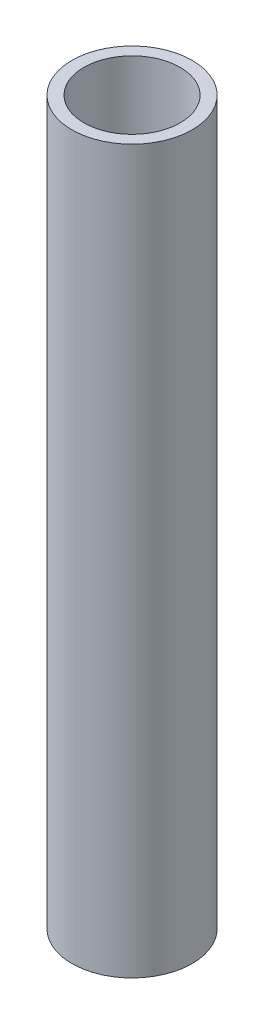
ISO-10303-21;
HEADER;
FILE_DESCRIPTION(('STEP AP214'),'2;1');
FILE_NAME('part.step','',(''),(''),'','','');
FILE_SCHEMA(('AUTOMOTIVE_DESIGN { 1 0 10303 214 1 1 1 1 }'));
ENDSEC;
DATA;
#1=APPLICATION_CONTEXT('core data for automotive mechanical design processes');
#2=APPLICATION_PROTOCOL_DEFINITION('international standard','automotive_design',2000,#1);
#3=PRODUCT_CONTEXT('',#1,'mechanical');
#4=PRODUCT('Part','Part','',(#3));
#5=PRODUCT_RELATED_PRODUCT_CATEGORY('part','',(#4));
#6=PRODUCT_DEFINITION_FORMATION('','',#4);
#7=PRODUCT_DEFINITION_CONTEXT('part definition',#1,'design');
#8=PRODUCT_DEFINITION('design','',#6,#7);
#9=PRODUCT_DEFINITION_SHAPE('','',#8);
#10=(LENGTH_UNIT() NAMED_UNIT(*) SI_UNIT(.MILLI.,.METRE.));
#11=(NAMED_UNIT(*) PLANE_ANGLE_UNIT() SI_UNIT($,.RADIAN.));
#12=(NAMED_UNIT(*) SI_UNIT($,.STERADIAN.) SOLID_ANGLE_UNIT());
#13=UNCERTAINTY_MEASURE_WITH_UNIT(LENGTH_MEASURE(1.E-05),#10,'distance_accuracy_value','');
#14=(GEOMETRIC_REPRESENTATION_CONTEXT(3) GLOBAL_UNCERTAINTY_ASSIGNED_CONTEXT((#13)) GLOBAL_UNIT_ASSIGNED_CONTEXT((#10,
#11,#12)) REPRESENTATION_CONTEXT('',''));
#15=CARTESIAN_POINT('',(0.,0.,0.));
#16=DIRECTION('',(0.,0.,1.));
#17=DIRECTION('',(1.,0.,0.));
#18=AXIS2_PLACEMENT_3D('',#15,#16,#17);
#19=CARTESIAN_POINT('',(0.,38.1,0.));
#20=DIRECTION('',(0.,1.,0.));
#21=DIRECTION('',(0.,0.,1.));
#22=AXIS2_PLACEMENT_3D('',#19,#20,#21);
#23=PLANE('',#22);
#24=CARTESIAN_POINT('',(0.,38.1,0.));
#25=DIRECTION('',(0.,1.,0.));
#26=DIRECTION('',(0.,0.,1.));
#27=AXIS2_PLACEMENT_3D('',#24,#25,#26);
#28=CIRCLE('',#27,3.175);
#29=CARTESIAN_POINT('',(0.,38.1,-3.175));
#30=VERTEX_POINT('',#29);
#31=EDGE_CURVE('E10',#30,#30,#28,.T.);
#32=ORIENTED_EDGE('',*,*,#31,.T.);
#33=EDGE_LOOP('',(#32));
#34=FACE_BOUND('',#33,.T.);
#35=CARTESIAN_POINT('',(0.,38.1,0.));
#36=DIRECTION('',(0.,1.,0.));
#37=DIRECTION('',(0.,0.,1.));
#38=AXIS2_PLACEMENT_3D('',#35,#36,#37);
#39=CIRCLE('',#38,2.54);
#40=CARTESIAN_POINT('',(0.,38.1,-2.54));
#41=VERTEX_POINT('',#40);
#42=EDGE_CURVE('E46',#41,#41,#39,.T.);
#43=ORIENTED_EDGE('',*,*,#42,.F.);
#44=EDGE_LOOP('',(#43));
#45=FACE_BOUND('',#44,.T.);
#46=ADVANCED_FACE('F35',(#34,#45),#23,.T.);
#47=CARTESIAN_POINT('',(0.,0.,0.));
#48=DIRECTION('',(0.,1.,0.));
#49=DIRECTION('',(0.,0.,1.));
#50=AXIS2_PLACEMENT_3D('',#47,#48,#49);
#51=PLANE('',#50);
#52=CARTESIAN_POINT('',(0.,0.,0.));
#53=DIRECTION('',(0.,1.,0.));
#54=DIRECTION('',(0.,0.,1.));
#55=AXIS2_PLACEMENT_3D('',#52,#53,#54);
#56=CIRCLE('',#55,3.175);
#57=CARTESIAN_POINT('',(0.,0.,-3.175));
#58=VERTEX_POINT('',#57);
#59=EDGE_CURVE('E39',#58,#58,#56,.T.);
#60=ORIENTED_EDGE('',*,*,#59,.F.);
#61=EDGE_LOOP('',(#60));
#62=FACE_BOUND('',#61,.T.);
#63=CARTESIAN_POINT('',(0.,0.,0.));
#64=DIRECTION('',(0.,1.,0.));
#65=DIRECTION('',(0.,0.,1.));
#66=AXIS2_PLACEMENT_3D('',#63,#64,#65);
#67=CIRCLE('',#66,2.54);
#68=CARTESIAN_POINT('',(0.,0.,-2.54));
#69=VERTEX_POINT('',#68);
#70=EDGE_CURVE('E48',#69,#69,#67,.T.);
#71=ORIENTED_EDGE('',*,*,#70,.T.);
#72=EDGE_LOOP('',(#71));
#73=FACE_BOUND('',#72,.T.);
#74=ADVANCED_FACE('F58',(#62,#73),#51,.F.);
#75=CARTESIAN_POINT('',(0.,38.1,0.));
#76=DIRECTION('',(0.,-1.,0.));
#77=DIRECTION('',(0.,0.,-1.));
#78=AXIS2_PLACEMENT_3D('',#75,#76,#77);
#79=CYLINDRICAL_SURFACE('',#78,3.175);
#80=CARTESIAN_POINT('',(0.,38.1,-3.175));
#81=CARTESIAN_POINT('',(0.,37.703125,-3.175));
#82=CARTESIAN_POINT('',(0.,37.30625,-3.175));
#83=CARTESIAN_POINT('',(0.,36.5125,-3.175));
#84=CARTESIAN_POINT('',(0.,36.115625,-3.175));
#85=CARTESIAN_POINT('',(0.,35.321875,-3.175));
#86=CARTESIAN_POINT('',(0.,34.925,-3.175));
#87=CARTESIAN_POINT('',(0.,34.13125,-3.175));
#88=CARTESIAN_POINT('',(0.,33.734375,-3.175));
#89=CARTESIAN_POINT('',(0.,32.940625,-3.175));
#90=CARTESIAN_POINT('',(0.,32.54375,-3.175));
#91=CARTESIAN_POINT('',(0.,31.75,-3.175));
#92=CARTESIAN_POINT('',(0.,31.353125,-3.175));
#93=CARTESIAN_POINT('',(0.,30.559375,-3.175));
#94=CARTESIAN_POINT('',(0.,30.1625,-3.175));
#95=CARTESIAN_POINT('',(0.,29.36875,-3.175));
#96=CARTESIAN_POINT('',(0.,28.971875,-3.175));
#97=CARTESIAN_POINT('',(0.,28.178125,-3.175));
#98=CARTESIAN_POINT('',(0.,27.78125,-3.175));
#99=CARTESIAN_POINT('',(0.,26.9875,-3.175));
#100=CARTESIAN_POINT('',(0.,26.590625,-3.175));
#101=CARTESIAN_POINT('',(0.,25.796875,-3.175));
#102=CARTESIAN_POINT('',(0.,25.4,-3.175));
#103=CARTESIAN_POINT('',(0.,24.60625,-3.175));
#104=CARTESIAN_POINT('',(0.,24.209375,-3.175));
#105=CARTESIAN_POINT('',(0.,23.415625,-3.175));
#106=CARTESIAN_POINT('',(0.,23.01875,-3.175));
#107=CARTESIAN_POINT('',(0.,22.225,-3.175));
#108=CARTESIAN_POINT('',(0.,21.828125,-3.175));
#109=CARTESIAN_POINT('',(0.,21.034375,-3.175));
#110=CARTESIAN_POINT('',(0.,20.6375,-3.175));
#111=CARTESIAN_POINT('',(0.,19.84375,-3.175));
#112=CARTESIAN_POINT('',(0.,19.446875,-3.175));
#113=CARTESIAN_POINT('',(0.,18.653125,-3.175));
#114=CARTESIAN_POINT('',(0.,18.25625,-3.175));
#115=CARTESIAN_POINT('',(0.,17.4625,-3.175));
#116=CARTESIAN_POINT('',(0.,17.065625,-3.175));
#117=CARTESIAN_POINT('',(0.,16.271875,-3.175));
#118=CARTESIAN_POINT('',(0.,15.875,-3.175));
#119=CARTESIAN_POINT('',(0.,15.08125,-3.175));
#120=CARTESIAN_POINT('',(0.,14.684375,-3.175));
#121=CARTESIAN_POINT('',(0.,13.890625,-3.175));
#122=CARTESIAN_POINT('',(0.,13.49375,-3.175));
#123=CARTESIAN_POINT('',(0.,12.7,-3.175));
#124=CARTESIAN_POINT('',(0.,12.303125,-3.175));
#125=CARTESIAN_POINT('',(0.,11.509375,-3.175));
#126=CARTESIAN_POINT('',(0.,11.1125,-3.175));
#127=CARTESIAN_POINT('',(0.,10.31875,-3.175));
#128=CARTESIAN_POINT('',(0.,9.921875,-3.175));
#129=CARTESIAN_POINT('',(0.,9.128125,-3.175));
#130=CARTESIAN_POINT('',(0.,8.73125,-3.175));
#131=CARTESIAN_POINT('',(0.,7.9375,-3.175));
#132=CARTESIAN_POINT('',(0.,7.540625,-3.175));
#133=CARTESIAN_POINT('',(0.,6.746875,-3.175));
#134=CARTESIAN_POINT('',(0.,6.35,-3.175));
#135=CARTESIAN_POINT('',(0.,5.55625,-3.175));
#136=CARTESIAN_POINT('',(0.,5.159375,-3.175));
#137=CARTESIAN_POINT('',(0.,4.365625,-3.175));
#138=CARTESIAN_POINT('',(0.,3.96875,-3.175));
#139=CARTESIAN_POINT('',(0.,3.175,-3.175));
#140=CARTESIAN_POINT('',(0.,2.778125,-3.175));
#141=CARTESIAN_POINT('',(0.,1.984375,-3.175));
#142=CARTESIAN_POINT('',(0.,1.5875,-3.175));
#143=CARTESIAN_POINT('',(0.,0.79375,-3.175));
#144=CARTESIAN_POINT('',(0.,0.396875,-3.175));
#145=CARTESIAN_POINT('',(0.,0.,-3.175));
#146=B_SPLINE_CURVE_WITH_KNOTS('',3,(#80,#81,#82,#83,#84,#85,#86,#87,#88,#89,#90,#91,#92,#93,
#94,#95,#96,#97,#98,#99,#100,#101,#102,#103,#104,#105,#106,#107,#108,#109,#110,#111,#112,#113,
#114,#115,#116,#117,#118,#119,#120,#121,#122,#123,#124,#125,#126,#127,#128,#129,#130,#131,#132,
#133,#134,#135,#136,#137,#138,#139,#140,#141,#142,#143,#144,#145),.UNSPECIFIED.,.F.,.F.,(4,2,2,
2,2,2,2,2,2,2,2,2,2,2,2,2,2,2,2,2,2,2,2,2,2,2,2,2,2,2,2,2,4),(0.,1.19062499999999,
2.38124999999999,3.571875,4.7625,5.953125,7.14375,8.33437499999999,9.525,10.715625,11.90625,
13.096875,14.2875,15.478125,16.66875,17.859375,19.05,20.240625,21.43125,22.621875,23.8125,
25.003125,26.19375,27.384375,28.575,29.765625,30.95625,32.146875,33.3375,34.528125,35.71875,
36.909375,38.1),.UNSPECIFIED.);
#147=EDGE_CURVE('BSEAM37',#30,#58,#146,.T.);
#148=ORIENTED_EDGE('',*,*,#31,.F.);
#149=ORIENTED_EDGE('',*,*,#59,.T.);
#150=ORIENTED_EDGE('',*,*,#147,.T.);
#151=ORIENTED_EDGE('',*,*,#147,.F.);
#152=EDGE_LOOP('',(#148,#150,#149,#151));
#153=FACE_BOUND('',#152,.T.);
#154=ADVANCED_FACE('F37',(#153),#79,.T.);
#155=CARTESIAN_POINT('',(0.,38.1,0.));
#156=DIRECTION('',(0.,-1.,0.));
#157=DIRECTION('',(0.,0.,-1.));
#158=AXIS2_PLACEMENT_3D('',#155,#156,#157);
#159=CYLINDRICAL_SURFACE('',#158,2.54);
#160=CARTESIAN_POINT('',(0.,38.1,-2.54));
#161=CARTESIAN_POINT('',(0.,37.703125,-2.54));
#162=CARTESIAN_POINT('',(0.,37.30625,-2.54));
#163=CARTESIAN_POINT('',(0.,36.5125,-2.54));
#164=CARTESIAN_POINT('',(0.,36.115625,-2.54));
#165=CARTESIAN_POINT('',(0.,35.321875,-2.54));
#166=CARTESIAN_POINT('',(0.,34.925,-2.54));
#167=CARTESIAN_POINT('',(0.,34.13125,-2.54));
#168=CARTESIAN_POINT('',(0.,33.734375,-2.54));
#169=CARTESIAN_POINT('',(0.,32.940625,-2.54));
#170=CARTESIAN_POINT('',(0.,32.54375,-2.54));
#171=CARTESIAN_POINT('',(0.,31.75,-2.54));
#172=CARTESIAN_POINT('',(0.,31.353125,-2.54));
#173=CARTESIAN_POINT('',(0.,30.559375,-2.54));
#174=CARTESIAN_POINT('',(0.,30.1625,-2.54));
#175=CARTESIAN_POINT('',(0.,29.36875,-2.54));
#176=CARTESIAN_POINT('',(0.,28.971875,-2.54));
#177=CARTESIAN_POINT('',(0.,28.178125,-2.54));
#178=CARTESIAN_POINT('',(0.,27.78125,-2.54));
#179=CARTESIAN_POINT('',(0.,26.9875,-2.54));
#180=CARTESIAN_POINT('',(0.,26.590625,-2.54));
#181=CARTESIAN_POINT('',(0.,25.796875,-2.54));
#182=CARTESIAN_POINT('',(0.,25.4,-2.54));
#183=CARTESIAN_POINT('',(0.,24.60625,-2.54));
#184=CARTESIAN_POINT('',(0.,24.209375,-2.54));
#185=CARTESIAN_POINT('',(0.,23.415625,-2.54));
#186=CARTESIAN_POINT('',(0.,23.01875,-2.54));
#187=CARTESIAN_POINT('',(0.,22.225,-2.54));
#188=CARTESIAN_POINT('',(0.,21.828125,-2.54));
#189=CARTESIAN_POINT('',(0.,21.034375,-2.54));
#190=CARTESIAN_POINT('',(0.,20.6375,-2.54));
#191=CARTESIAN_POINT('',(0.,19.84375,-2.54));
#192=CARTESIAN_POINT('',(0.,19.446875,-2.54));
#193=CARTESIAN_POINT('',(0.,18.653125,-2.54));
#194=CARTESIAN_POINT('',(0.,18.25625,-2.54));
#195=CARTESIAN_POINT('',(0.,17.4625,-2.54));
#196=CARTESIAN_POINT('',(0.,17.065625,-2.54));
#197=CARTESIAN_POINT('',(0.,16.271875,-2.54));
#198=CARTESIAN_POINT('',(0.,15.875,-2.54));
#199=CARTESIAN_POINT('',(0.,15.08125,-2.54));
#200=CARTESIAN_POINT('',(0.,14.684375,-2.54));
#201=CARTESIAN_POINT('',(0.,13.890625,-2.54));
#202=CARTESIAN_POINT('',(0.,13.49375,-2.54));
#203=CARTESIAN_POINT('',(0.,12.7,-2.54));
#204=CARTESIAN_POINT('',(0.,12.303125,-2.54));
#205=CARTESIAN_POINT('',(0.,11.509375,-2.54));
#206=CARTESIAN_POINT('',(0.,11.1125,-2.54));
#207=CARTESIAN_POINT('',(0.,10.31875,-2.54));
#208=CARTESIAN_POINT('',(0.,9.921875,-2.54));
#209=CARTESIAN_POINT('',(0.,9.128125,-2.54));
#210=CARTESIAN_POINT('',(0.,8.73125,-2.54));
#211=CARTESIAN_POINT('',(0.,7.9375,-2.54));
#212=CARTESIAN_POINT('',(0.,7.540625,-2.54));
#213=CARTESIAN_POINT('',(0.,6.746875,-2.54));
#214=CARTESIAN_POINT('',(0.,6.35,-2.54));
#215=CARTESIAN_POINT('',(0.,5.55625,-2.54));
#216=CARTESIAN_POINT('',(0.,5.159375,-2.54));
#217=CARTESIAN_POINT('',(0.,4.365625,-2.54));
#218=CARTESIAN_POINT('',(0.,3.96875,-2.54));
#219=CARTESIAN_POINT('',(0.,3.175,-2.54));
#220=CARTESIAN_POINT('',(0.,2.778125,-2.54));
#221=CARTESIAN_POINT('',(0.,1.984375,-2.54));
#222=CARTESIAN_POINT('',(0.,1.5875,-2.54));
#223=CARTESIAN_POINT('',(0.,0.79375,-2.54));
#224=CARTESIAN_POINT('',(0.,0.396875,-2.54));
#225=CARTESIAN_POINT('',(0.,0.,-2.54));
#226=B_SPLINE_CURVE_WITH_KNOTS('',3,(#160,#161,#162,#163,#164,#165,#166,#167,#168,#169,#170,
#171,#172,#173,#174,#175,#176,#177,#178,#179,#180,#181,#182,#183,#184,#185,#186,#187,#188,#189,
#190,#191,#192,#193,#194,#195,#196,#197,#198,#199,#200,#201,#202,#203,#204,#205,#206,#207,#208,
#209,#210,#211,#212,#213,#214,#215,#216,#217,#218,#219,#220,#221,#222,#223,#224,#225),
.UNSPECIFIED.,.F.,.F.,(4,2,2,2,2,2,2,2,2,2,2,2,2,2,2,2,2,2,2,2,2,2,2,2,2,2,2,2,2,2,2,2,4),(0.,
1.19062499999999,2.38124999999999,3.571875,4.7625,5.953125,7.14375,8.33437499999999,9.525,
10.715625,11.90625,13.096875,14.2875,15.478125,16.66875,17.859375,19.05,20.240625,21.43125,
22.621875,23.8125,25.003125,26.19375,27.384375,28.575,29.765625,30.95625,32.146875,33.3375,
34.528125,35.71875,36.909375,38.1),.UNSPECIFIED.);
#227=EDGE_CURVE('BSEAM54',#41,#69,#226,.T.);
#228=ORIENTED_EDGE('',*,*,#42,.T.);
#229=ORIENTED_EDGE('',*,*,#70,.F.);
#230=ORIENTED_EDGE('',*,*,#227,.T.);
#231=ORIENTED_EDGE('',*,*,#227,.F.);
#232=EDGE_LOOP('',(#228,#230,#229,#231));
#233=FACE_BOUND('',#232,.T.);
#234=ADVANCED_FACE('F54',(#233),#159,.F.);
#235=CLOSED_SHELL('',(#46,#74,#154,#234));
#236=MANIFOLD_SOLID_BREP('B2',#235);
#237=ADVANCED_BREP_SHAPE_REPRESENTATION('',(#18,#236),#14);
#238=SHAPE_DEFINITION_REPRESENTATION(#9,#237);
ENDSEC;
END-ISO-10303-21;
